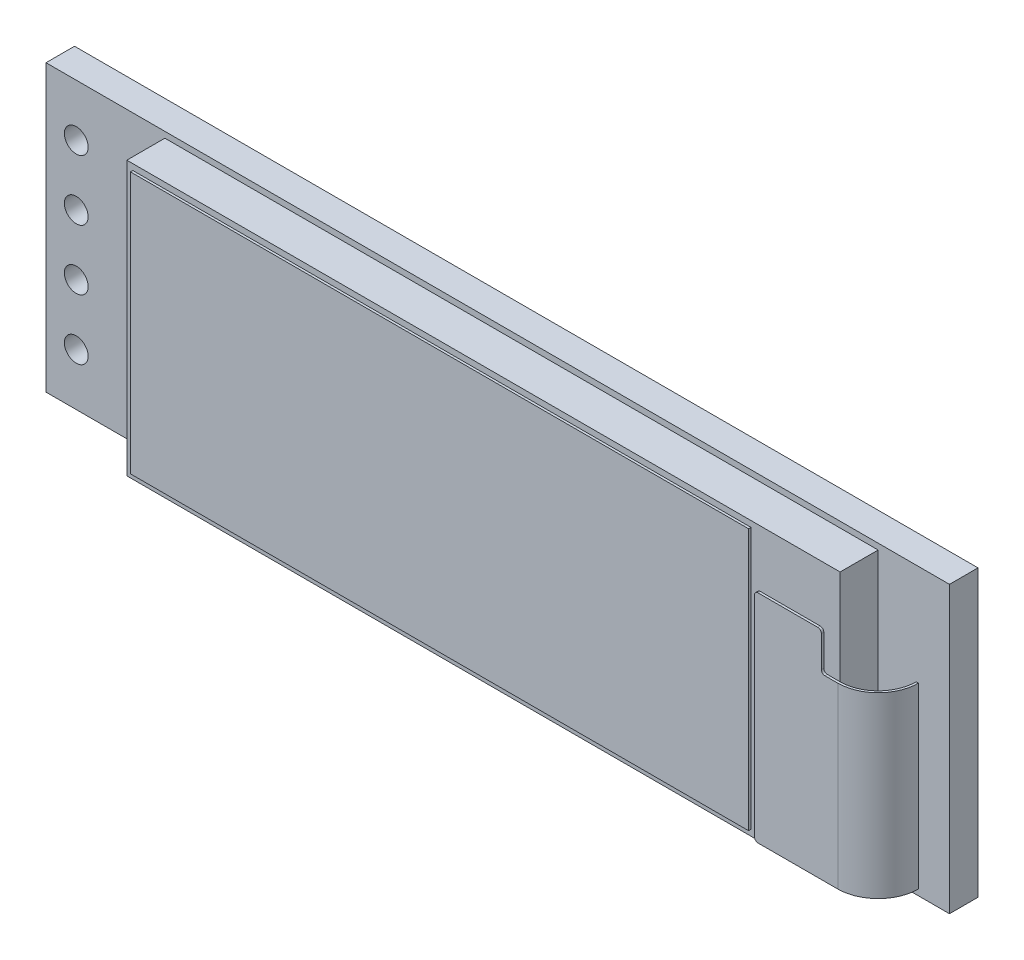
ISO-10303-21;
HEADER;
FILE_DESCRIPTION(('STEP AP214'),'2;1');
FILE_NAME('part.step','',(''),(''),'','','');
FILE_SCHEMA(('AUTOMOTIVE_DESIGN { 1 0 10303 214 1 1 1 1 }'));
ENDSEC;
DATA;
#1=APPLICATION_CONTEXT('core data for automotive mechanical design processes');
#2=APPLICATION_PROTOCOL_DEFINITION('international standard','automotive_design',2000,#1);
#3=PRODUCT_CONTEXT('',#1,'mechanical');
#4=PRODUCT('Part','Part','',(#3));
#5=PRODUCT_RELATED_PRODUCT_CATEGORY('part','',(#4));
#6=PRODUCT_DEFINITION_FORMATION('','',#4);
#7=PRODUCT_DEFINITION_CONTEXT('part definition',#1,'design');
#8=PRODUCT_DEFINITION('design','',#6,#7);
#9=PRODUCT_DEFINITION_SHAPE('','',#8);
#10=(LENGTH_UNIT() NAMED_UNIT(*) SI_UNIT(.MILLI.,.METRE.));
#11=(NAMED_UNIT(*) PLANE_ANGLE_UNIT() SI_UNIT($,.RADIAN.));
#12=(NAMED_UNIT(*) SI_UNIT($,.STERADIAN.) SOLID_ANGLE_UNIT());
#13=UNCERTAINTY_MEASURE_WITH_UNIT(LENGTH_MEASURE(1.E-05),#10,'distance_accuracy_value','');
#14=(GEOMETRIC_REPRESENTATION_CONTEXT(3) GLOBAL_UNCERTAINTY_ASSIGNED_CONTEXT((#13)) GLOBAL_UNIT_ASSIGNED_CONTEXT((#10,
#11,#12)) REPRESENTATION_CONTEXT('',''));
#15=CARTESIAN_POINT('',(0.,0.,0.));
#16=DIRECTION('',(0.,0.,1.));
#17=DIRECTION('',(1.,0.,0.));
#18=AXIS2_PLACEMENT_3D('',#15,#16,#17);
#19=CARTESIAN_POINT('',(16.,1.75,1.2));
#20=DIRECTION('',(0.,-1.,0.));
#21=DIRECTION('',(0.,0.,-1.));
#22=AXIS2_PLACEMENT_3D('',#19,#20,#21);
#23=CYLINDRICAL_SURFACE('',#22,1.69619898871096);
#24=CARTESIAN_POINT('',(16.,-5.75,1.2));
#25=DIRECTION('',(0.,-1.,0.));
#26=DIRECTION('',(0.,0.,1.));
#27=AXIS2_PLACEMENT_3D('',#24,#25,#26);
#28=CIRCLE('',#27,1.69619898871096);
#29=CARTESIAN_POINT('',(17.696198988711,-5.75,1.2));
#30=VERTEX_POINT('',#29);
#31=CARTESIAN_POINT('',(16.,-5.75,2.89809949435548));
#32=VERTEX_POINT('',#31);
#33=EDGE_CURVE('E372',#30,#32,#28,.T.);
#34=ORIENTED_EDGE('',*,*,#33,.F.);
#35=DIRECTION('',(0.,-1.,0.));
#36=VECTOR('',#35,1.);
#37=CARTESIAN_POINT('',(17.696198988711,1.75,1.2));
#38=LINE('',#37,#36);
#39=CARTESIAN_POINT('',(17.696198988711,1.75,1.2));
#40=VERTEX_POINT('',#39);
#41=EDGE_CURVE('E11',#40,#30,#38,.T.);
#42=ORIENTED_EDGE('',*,*,#41,.F.);
#43=CARTESIAN_POINT('',(16.,1.75,1.2));
#44=DIRECTION('',(0.,-1.,0.));
#45=DIRECTION('',(0.,0.,1.));
#46=AXIS2_PLACEMENT_3D('',#43,#44,#45);
#47=CIRCLE('',#46,1.69619898871096);
#48=CARTESIAN_POINT('',(16.,1.75,2.89809949435548));
#49=VERTEX_POINT('',#48);
#50=EDGE_CURVE('E57',#40,#49,#47,.T.);
#51=ORIENTED_EDGE('',*,*,#50,.T.);
#52=CARTESIAN_POINT('',(16.,1.75,2.89619898871096));
#53=DIRECTION('',(0.,-1.,0.));
#54=VECTOR('',#53,1.);
#55=LINE('',#52,#54);
#56=EDGE_CURVE('E66',#49,#32,#55,.T.);
#57=ORIENTED_EDGE('',*,*,#56,.T.);
#58=EDGE_LOOP('',(#34,#42,#51,#57));
#59=FACE_BOUND('',#58,.T.);
#60=ADVANCED_FACE('F39',(#59),#23,.T.);
#61=CARTESIAN_POINT('',(16.,1.75,1.2));
#62=DIRECTION('',(0.,-1.,0.));
#63=DIRECTION('',(0.,0.,-1.));
#64=AXIS2_PLACEMENT_3D('',#61,#62,#63);
#65=CYLINDRICAL_SURFACE('',#64,1.6);
#66=CARTESIAN_POINT('',(16.,-5.75,1.2));
#67=DIRECTION('',(0.,1.,0.));
#68=DIRECTION('',(0.,0.,1.));
#69=AXIS2_PLACEMENT_3D('',#66,#67,#68);
#70=CIRCLE('',#69,1.6);
#71=CARTESIAN_POINT('',(16.,-5.75,2.8));
#72=VERTEX_POINT('',#71);
#73=CARTESIAN_POINT('',(17.6,-5.75,1.2));
#74=VERTEX_POINT('',#73);
#75=EDGE_CURVE('E437',#72,#74,#70,.T.);
#76=ORIENTED_EDGE('',*,*,#75,.F.);
#77=DIRECTION('',(0.,-1.,0.));
#78=VECTOR('',#77,1.);
#79=CARTESIAN_POINT('',(16.,1.75,2.8));
#80=LINE('',#79,#78);
#81=CARTESIAN_POINT('',(16.,1.75,2.8));
#82=VERTEX_POINT('',#81);
#83=EDGE_CURVE('E440',#82,#72,#80,.T.);
#84=ORIENTED_EDGE('',*,*,#83,.F.);
#85=CARTESIAN_POINT('',(16.,1.75,1.2));
#86=DIRECTION('',(0.,1.,0.));
#87=DIRECTION('',(0.,0.,1.));
#88=AXIS2_PLACEMENT_3D('',#85,#86,#87);
#89=CIRCLE('',#88,1.6);
#90=CARTESIAN_POINT('',(17.6,1.75,1.2));
#91=VERTEX_POINT('',#90);
#92=EDGE_CURVE('E462',#82,#91,#89,.T.);
#93=ORIENTED_EDGE('',*,*,#92,.T.);
#94=DIRECTION('',(0.,-1.,0.));
#95=VECTOR('',#94,1.);
#96=CARTESIAN_POINT('',(17.6,1.75,1.2));
#97=LINE('',#96,#95);
#98=EDGE_CURVE('E49',#91,#74,#97,.T.);
#99=ORIENTED_EDGE('',*,*,#98,.T.);
#100=EDGE_LOOP('',(#76,#84,#93,#99));
#101=FACE_BOUND('',#100,.T.);
#102=ADVANCED_FACE('F424',(#101),#65,.F.);
#103=CARTESIAN_POINT('',(16.,1.75,1.2));
#104=DIRECTION('',(0.,1.,0.));
#105=DIRECTION('',(0.,0.,1.));
#106=AXIS2_PLACEMENT_3D('',#103,#104,#105);
#107=PLANE('',#106);
#108=ORIENTED_EDGE('',*,*,#50,.F.);
#109=DIRECTION('',(1.,0.,0.));
#110=VECTOR('',#109,1.);
#111=CARTESIAN_POINT('',(17.6,1.75,1.2));
#112=LINE('',#111,#110);
#113=EDGE_CURVE('E448',#91,#40,#112,.T.);
#114=ORIENTED_EDGE('',*,*,#113,.F.);
#115=ORIENTED_EDGE('',*,*,#92,.F.);
#116=DIRECTION('',(-1.,0.,0.));
#117=VECTOR('',#116,1.);
#118=CARTESIAN_POINT('',(16.,1.75,2.8));
#119=LINE('',#118,#117);
#120=CARTESIAN_POINT('',(15.4636021064431,1.75,2.8));
#121=VERTEX_POINT('',#120);
#122=EDGE_CURVE('E296',#82,#121,#119,.T.);
#123=ORIENTED_EDGE('',*,*,#122,.T.);
#124=DIRECTION('',(0.,0.,-1.));
#125=VECTOR('',#124,1.);
#126=CARTESIAN_POINT('',(15.4636021064431,1.75,2.9));
#127=LINE('',#126,#125);
#128=CARTESIAN_POINT('',(15.4636021064431,1.75,2.9));
#129=VERTEX_POINT('',#128);
#130=EDGE_CURVE('E369',#129,#121,#127,.T.);
#131=ORIENTED_EDGE('',*,*,#130,.F.);
#132=DIRECTION('',(-1.,0.,0.));
#133=VECTOR('',#132,1.);
#134=CARTESIAN_POINT('',(16.,1.75,2.9));
#135=LINE('',#134,#133);
#136=EDGE_CURVE('E313',#49,#129,#135,.T.);
#137=ORIENTED_EDGE('',*,*,#136,.F.);
#138=EDGE_LOOP('',(#108,#114,#115,#123,#131,#137));
#139=FACE_BOUND('',#138,.T.);
#140=ADVANCED_FACE('F421',(#139),#107,.T.);
#141=CARTESIAN_POINT('',(16.,-5.75,1.2));
#142=DIRECTION('',(0.,1.,0.));
#143=DIRECTION('',(0.,0.,1.));
#144=AXIS2_PLACEMENT_3D('',#141,#142,#143);
#145=PLANE('',#144);
#146=ORIENTED_EDGE('',*,*,#33,.T.);
#147=DIRECTION('',(1.,0.,0.));
#148=VECTOR('',#147,1.);
#149=CARTESIAN_POINT('',(12.6495314069062,-5.75,2.9));
#150=LINE('',#149,#148);
#151=CARTESIAN_POINT('',(12.6495314069062,-5.75,2.9));
#152=VERTEX_POINT('',#151);
#153=EDGE_CURVE('E324',#152,#32,#150,.T.);
#154=ORIENTED_EDGE('',*,*,#153,.F.);
#155=DIRECTION('',(0.,0.,-1.));
#156=VECTOR('',#155,1.);
#157=CARTESIAN_POINT('',(12.6495314069062,-5.75,2.9));
#158=LINE('',#157,#156);
#159=CARTESIAN_POINT('',(12.6495314069062,-5.75,2.8));
#160=VERTEX_POINT('',#159);
#161=EDGE_CURVE('E348',#152,#160,#158,.T.);
#162=ORIENTED_EDGE('',*,*,#161,.T.);
#163=DIRECTION('',(1.,0.,0.));
#164=VECTOR('',#163,1.);
#165=CARTESIAN_POINT('',(-14.,-5.75,2.8));
#166=LINE('',#165,#164);
#167=CARTESIAN_POINT('',(-14.,-5.75,2.8));
#168=VERTEX_POINT('',#167);
#169=EDGE_CURVE('E245',#168,#160,#166,.T.);
#170=ORIENTED_EDGE('',*,*,#169,.F.);
#171=DIRECTION('',(0.,0.,-1.));
#172=VECTOR('',#171,1.);
#173=CARTESIAN_POINT('',(-14.,-5.75,2.8));
#174=LINE('',#173,#172);
#175=CARTESIAN_POINT('',(-14.,-5.75,1.2));
#176=VERTEX_POINT('',#175);
#177=EDGE_CURVE('E257',#168,#176,#174,.T.);
#178=ORIENTED_EDGE('',*,*,#177,.T.);
#179=DIRECTION('',(1.,0.,0.));
#180=VECTOR('',#179,1.);
#181=CARTESIAN_POINT('',(-14.,-5.75,1.2));
#182=LINE('',#181,#180);
#183=CARTESIAN_POINT('',(16.,-5.75,1.2));
#184=VERTEX_POINT('',#183);
#185=EDGE_CURVE('E241',#176,#184,#182,.T.);
#186=ORIENTED_EDGE('',*,*,#185,.T.);
#187=DIRECTION('',(0.,0.,-1.));
#188=VECTOR('',#187,1.);
#189=CARTESIAN_POINT('',(16.,-5.75,2.8));
#190=LINE('',#189,#188);
#191=EDGE_CURVE('E246',#72,#184,#190,.T.);
#192=ORIENTED_EDGE('',*,*,#191,.F.);
#193=ORIENTED_EDGE('',*,*,#75,.T.);
#194=DIRECTION('',(1.,0.,0.));
#195=VECTOR('',#194,1.);
#196=CARTESIAN_POINT('',(17.6,-5.75,1.2));
#197=LINE('',#196,#195);
#198=EDGE_CURVE('E444',#74,#30,#197,.T.);
#199=ORIENTED_EDGE('',*,*,#198,.T.);
#200=EDGE_LOOP('',(#146,#154,#162,#170,#178,#186,#192,#193,#199));
#201=FACE_BOUND('',#200,.T.);
#202=ADVANCED_FACE('F419',(#201),#145,.F.);
#203=CARTESIAN_POINT('',(15.4636021064431,1.9,2.9));
#204=DIRECTION('',(0.,0.,-1.));
#205=DIRECTION('',(-1.,0.,0.));
#206=AXIS2_PLACEMENT_3D('',#203,#204,#205);
#207=CYLINDRICAL_SURFACE('',#206,0.15);
#208=CARTESIAN_POINT('',(15.4636021064431,1.9,2.8));
#209=DIRECTION('',(0.,0.,-1.));
#210=DIRECTION('',(-1.,0.,0.));
#211=AXIS2_PLACEMENT_3D('',#208,#209,#210);
#212=CIRCLE('',#211,0.15);
#213=CARTESIAN_POINT('',(15.3136021064431,1.9,2.8));
#214=VERTEX_POINT('',#213);
#215=EDGE_CURVE('E327',#121,#214,#212,.T.);
#216=ORIENTED_EDGE('',*,*,#215,.T.);
#217=DIRECTION('',(0.,0.,-1.));
#218=VECTOR('',#217,1.);
#219=CARTESIAN_POINT('',(15.3136021064431,1.9,2.9));
#220=LINE('',#219,#218);
#221=CARTESIAN_POINT('',(15.3136021064431,1.9,2.9));
#222=VERTEX_POINT('',#221);
#223=EDGE_CURVE('E366',#222,#214,#220,.T.);
#224=ORIENTED_EDGE('',*,*,#223,.F.);
#225=CARTESIAN_POINT('',(15.4636021064431,1.9,2.9));
#226=DIRECTION('',(0.,0.,-1.));
#227=DIRECTION('',(-1.,0.,0.));
#228=AXIS2_PLACEMENT_3D('',#225,#226,#227);
#229=CIRCLE('',#228,0.15);
#230=EDGE_CURVE('E310',#129,#222,#229,.T.);
#231=ORIENTED_EDGE('',*,*,#230,.F.);
#232=ORIENTED_EDGE('',*,*,#130,.T.);
#233=EDGE_LOOP('',(#216,#224,#231,#232));
#234=FACE_BOUND('',#233,.T.);
#235=ADVANCED_FACE('F415',(#234),#207,.F.);
#236=CARTESIAN_POINT('',(15.3136021064431,1.9,2.9));
#237=DIRECTION('',(-1.,0.,0.));
#238=DIRECTION('',(0.,0.,1.));
#239=AXIS2_PLACEMENT_3D('',#236,#237,#238);
#240=PLANE('',#239);
#241=DIRECTION('',(0.,1.,0.));
#242=VECTOR('',#241,1.);
#243=CARTESIAN_POINT('',(15.3136021064431,1.9,2.8));
#244=LINE('',#243,#242);
#245=CARTESIAN_POINT('',(15.3136021064431,3.21377728050559,2.8));
#246=VERTEX_POINT('',#245);
#247=EDGE_CURVE('E330',#214,#246,#244,.T.);
#248=ORIENTED_EDGE('',*,*,#247,.T.);
#249=DIRECTION('',(0.,0.,-1.));
#250=VECTOR('',#249,1.);
#251=CARTESIAN_POINT('',(15.3136021064431,3.21377728050559,2.9));
#252=LINE('',#251,#250);
#253=CARTESIAN_POINT('',(15.3136021064431,3.21377728050559,2.9));
#254=VERTEX_POINT('',#253);
#255=EDGE_CURVE('E363',#254,#246,#252,.T.);
#256=ORIENTED_EDGE('',*,*,#255,.F.);
#257=DIRECTION('',(0.,1.,0.));
#258=VECTOR('',#257,1.);
#259=CARTESIAN_POINT('',(15.3136021064431,1.9,2.9));
#260=LINE('',#259,#258);
#261=EDGE_CURVE('E312',#222,#254,#260,.T.);
#262=ORIENTED_EDGE('',*,*,#261,.F.);
#263=ORIENTED_EDGE('',*,*,#223,.T.);
#264=EDGE_LOOP('',(#248,#256,#262,#263));
#265=FACE_BOUND('',#264,.T.);
#266=ADVANCED_FACE('F411',(#265),#240,.F.);
#267=CARTESIAN_POINT('',(15.1636021064431,3.21377728050559,2.9));
#268=DIRECTION('',(0.,0.,-1.));
#269=DIRECTION('',(-1.,0.,0.));
#270=AXIS2_PLACEMENT_3D('',#267,#268,#269);
#271=CYLINDRICAL_SURFACE('',#270,0.15);
#272=CARTESIAN_POINT('',(15.1636021064431,3.21377728050559,2.8));
#273=DIRECTION('',(0.,0.,1.));
#274=DIRECTION('',(-1.,0.,0.));
#275=AXIS2_PLACEMENT_3D('',#272,#273,#274);
#276=CIRCLE('',#275,0.15);
#277=CARTESIAN_POINT('',(15.1636021064431,3.36377728050559,2.8));
#278=VERTEX_POINT('',#277);
#279=EDGE_CURVE('E333',#246,#278,#276,.T.);
#280=ORIENTED_EDGE('',*,*,#279,.T.);
#281=DIRECTION('',(0.,0.,-1.));
#282=VECTOR('',#281,1.);
#283=CARTESIAN_POINT('',(15.1636021064431,3.36377728050559,2.9));
#284=LINE('',#283,#282);
#285=CARTESIAN_POINT('',(15.1636021064431,3.36377728050559,2.9));
#286=VERTEX_POINT('',#285);
#287=EDGE_CURVE('E360',#286,#278,#284,.T.);
#288=ORIENTED_EDGE('',*,*,#287,.F.);
#289=CARTESIAN_POINT('',(15.1636021064431,3.21377728050559,2.9));
#290=DIRECTION('',(0.,0.,1.));
#291=DIRECTION('',(-1.,0.,0.));
#292=AXIS2_PLACEMENT_3D('',#289,#290,#291);
#293=CIRCLE('',#292,0.15);
#294=EDGE_CURVE('E315',#254,#286,#293,.T.);
#295=ORIENTED_EDGE('',*,*,#294,.F.);
#296=ORIENTED_EDGE('',*,*,#255,.T.);
#297=EDGE_LOOP('',(#280,#288,#295,#296));
#298=FACE_BOUND('',#297,.T.);
#299=ADVANCED_FACE('F407',(#298),#271,.T.);
#300=CARTESIAN_POINT('',(15.1636021064431,3.36377728050559,2.9));
#301=DIRECTION('',(0.,-1.,0.));
#302=DIRECTION('',(0.,0.,-1.));
#303=AXIS2_PLACEMENT_3D('',#300,#301,#302);
#304=PLANE('',#303);
#305=DIRECTION('',(-1.,0.,0.));
#306=VECTOR('',#305,1.);
#307=CARTESIAN_POINT('',(15.1636021064431,3.36377728050559,2.8));
#308=LINE('',#307,#306);
#309=CARTESIAN_POINT('',(12.6495314069062,3.36377728050559,2.8));
#310=VERTEX_POINT('',#309);
#311=EDGE_CURVE('E336',#278,#310,#308,.T.);
#312=ORIENTED_EDGE('',*,*,#311,.T.);
#313=DIRECTION('',(0.,0.,-1.));
#314=VECTOR('',#313,1.);
#315=CARTESIAN_POINT('',(12.6495314069062,3.36377728050559,2.9));
#316=LINE('',#315,#314);
#317=CARTESIAN_POINT('',(12.6495314069062,3.36377728050559,2.9));
#318=VERTEX_POINT('',#317);
#319=EDGE_CURVE('E357',#318,#310,#316,.T.);
#320=ORIENTED_EDGE('',*,*,#319,.F.);
#321=DIRECTION('',(-1.,0.,0.));
#322=VECTOR('',#321,1.);
#323=CARTESIAN_POINT('',(15.1636021064431,3.36377728050559,2.9));
#324=LINE('',#323,#322);
#325=EDGE_CURVE('E317',#286,#318,#324,.T.);
#326=ORIENTED_EDGE('',*,*,#325,.F.);
#327=ORIENTED_EDGE('',*,*,#287,.T.);
#328=EDGE_LOOP('',(#312,#320,#326,#327));
#329=FACE_BOUND('',#328,.T.);
#330=ADVANCED_FACE('F403',(#329),#304,.F.);
#331=CARTESIAN_POINT('',(12.6495314069062,3.21377728050559,2.9));
#332=DIRECTION('',(0.,0.,-1.));
#333=DIRECTION('',(-1.,0.,0.));
#334=AXIS2_PLACEMENT_3D('',#331,#332,#333);
#335=CYLINDRICAL_SURFACE('',#334,0.15);
#336=CARTESIAN_POINT('',(12.6495314069062,3.21377728050559,2.8));
#337=DIRECTION('',(0.,0.,1.));
#338=DIRECTION('',(-1.,0.,0.));
#339=AXIS2_PLACEMENT_3D('',#336,#337,#338);
#340=CIRCLE('',#339,0.15);
#341=CARTESIAN_POINT('',(12.4995314069062,3.21377728050559,2.8));
#342=VERTEX_POINT('',#341);
#343=EDGE_CURVE('E339',#310,#342,#340,.T.);
#344=ORIENTED_EDGE('',*,*,#343,.T.);
#345=DIRECTION('',(0.,0.,-1.));
#346=VECTOR('',#345,1.);
#347=CARTESIAN_POINT('',(12.4995314069062,3.21377728050559,2.9));
#348=LINE('',#347,#346);
#349=CARTESIAN_POINT('',(12.4995314069062,3.21377728050559,2.9));
#350=VERTEX_POINT('',#349);
#351=EDGE_CURVE('E354',#350,#342,#348,.T.);
#352=ORIENTED_EDGE('',*,*,#351,.F.);
#353=CARTESIAN_POINT('',(12.6495314069062,3.21377728050559,2.9));
#354=DIRECTION('',(0.,0.,1.));
#355=DIRECTION('',(-1.,0.,0.));
#356=AXIS2_PLACEMENT_3D('',#353,#354,#355);
#357=CIRCLE('',#356,0.15);
#358=EDGE_CURVE('E319',#318,#350,#357,.T.);
#359=ORIENTED_EDGE('',*,*,#358,.F.);
#360=ORIENTED_EDGE('',*,*,#319,.T.);
#361=EDGE_LOOP('',(#344,#352,#359,#360));
#362=FACE_BOUND('',#361,.T.);
#363=ADVANCED_FACE('F399',(#362),#335,.T.);
#364=CARTESIAN_POINT('',(12.4995314069062,3.21377728050559,2.9));
#365=DIRECTION('',(1.,0.,0.));
#366=DIRECTION('',(0.,0.,-1.));
#367=AXIS2_PLACEMENT_3D('',#364,#365,#366);
#368=PLANE('',#367);
#369=DIRECTION('',(0.,-1.,0.));
#370=VECTOR('',#369,1.);
#371=CARTESIAN_POINT('',(12.4995314069062,3.21377728050559,2.8));
#372=LINE('',#371,#370);
#373=CARTESIAN_POINT('',(12.4995314069062,-5.6,2.8));
#374=VERTEX_POINT('',#373);
#375=EDGE_CURVE('E342',#342,#374,#372,.T.);
#376=ORIENTED_EDGE('',*,*,#375,.T.);
#377=DIRECTION('',(0.,0.,-1.));
#378=VECTOR('',#377,1.);
#379=CARTESIAN_POINT('',(12.4995314069062,-5.6,2.9));
#380=LINE('',#379,#378);
#381=CARTESIAN_POINT('',(12.4995314069062,-5.6,2.9));
#382=VERTEX_POINT('',#381);
#383=EDGE_CURVE('E351',#382,#374,#380,.T.);
#384=ORIENTED_EDGE('',*,*,#383,.F.);
#385=DIRECTION('',(0.,-1.,0.));
#386=VECTOR('',#385,1.);
#387=CARTESIAN_POINT('',(12.4995314069062,3.21377728050559,2.9));
#388=LINE('',#387,#386);
#389=EDGE_CURVE('E321',#350,#382,#388,.T.);
#390=ORIENTED_EDGE('',*,*,#389,.F.);
#391=ORIENTED_EDGE('',*,*,#351,.T.);
#392=EDGE_LOOP('',(#376,#384,#390,#391));
#393=FACE_BOUND('',#392,.T.);
#394=ADVANCED_FACE('F395',(#393),#368,.F.);
#395=CARTESIAN_POINT('',(12.6495314069062,-5.6,2.9));
#396=DIRECTION('',(0.,0.,-1.));
#397=DIRECTION('',(-1.,0.,0.));
#398=AXIS2_PLACEMENT_3D('',#395,#396,#397);
#399=CYLINDRICAL_SURFACE('',#398,0.15);
#400=CARTESIAN_POINT('',(12.6495314069062,-5.6,2.8));
#401=DIRECTION('',(0.,0.,1.));
#402=DIRECTION('',(-1.,0.,0.));
#403=AXIS2_PLACEMENT_3D('',#400,#401,#402);
#404=CIRCLE('',#403,0.15);
#405=EDGE_CURVE('E345',#374,#160,#404,.T.);
#406=ORIENTED_EDGE('',*,*,#405,.T.);
#407=ORIENTED_EDGE('',*,*,#161,.F.);
#408=CARTESIAN_POINT('',(12.6495314069062,-5.6,2.9));
#409=DIRECTION('',(0.,0.,1.));
#410=DIRECTION('',(-1.,0.,0.));
#411=AXIS2_PLACEMENT_3D('',#408,#409,#410);
#412=CIRCLE('',#411,0.15);
#413=EDGE_CURVE('E75',#382,#152,#412,.T.);
#414=ORIENTED_EDGE('',*,*,#413,.F.);
#415=ORIENTED_EDGE('',*,*,#383,.T.);
#416=EDGE_LOOP('',(#406,#407,#414,#415));
#417=FACE_BOUND('',#416,.T.);
#418=ADVANCED_FACE('F390',(#417),#399,.T.);
#419=CARTESIAN_POINT('',(15.4636021064431,1.9,2.9));
#420=DIRECTION('',(0.,0.,-1.));
#421=DIRECTION('',(-1.,0.,0.));
#422=AXIS2_PLACEMENT_3D('',#419,#420,#421);
#423=PLANE('',#422);
#424=ORIENTED_EDGE('',*,*,#56,.F.);
#425=ORIENTED_EDGE('',*,*,#136,.T.);
#426=ORIENTED_EDGE('',*,*,#230,.T.);
#427=ORIENTED_EDGE('',*,*,#261,.T.);
#428=ORIENTED_EDGE('',*,*,#294,.T.);
#429=ORIENTED_EDGE('',*,*,#325,.T.);
#430=ORIENTED_EDGE('',*,*,#358,.T.);
#431=ORIENTED_EDGE('',*,*,#389,.T.);
#432=ORIENTED_EDGE('',*,*,#413,.T.);
#433=ORIENTED_EDGE('',*,*,#153,.T.);
#434=EDGE_LOOP('',(#424,#425,#426,#427,#428,#429,#430,#431,#432,#433));
#435=FACE_BOUND('',#434,.T.);
#436=ADVANCED_FACE('F379',(#435),#423,.F.);
#437=CARTESIAN_POINT('',(0.,0.,2.8));
#438=DIRECTION('',(0.,0.,-1.));
#439=DIRECTION('',(-1.,0.,0.));
#440=AXIS2_PLACEMENT_3D('',#437,#438,#439);
#441=PLANE('',#440);
#442=DIRECTION('',(0.,1.,0.));
#443=VECTOR('',#442,1.);
#444=CARTESIAN_POINT('',(12.25,5.5,2.8));
#445=LINE('',#444,#443);
#446=CARTESIAN_POINT('',(12.25,-5.5,2.8));
#447=VERTEX_POINT('',#446);
#448=CARTESIAN_POINT('',(12.25,5.5,2.8));
#449=VERTEX_POINT('',#448);
#450=EDGE_CURVE('E228',#447,#449,#445,.T.);
#451=ORIENTED_EDGE('',*,*,#450,.F.);
#452=DIRECTION('',(1.,0.,0.));
#453=VECTOR('',#452,1.);
#454=CARTESIAN_POINT('',(-13.75,-5.5,2.8));
#455=LINE('',#454,#453);
#456=CARTESIAN_POINT('',(-13.75,-5.5,2.8));
#457=VERTEX_POINT('',#456);
#458=EDGE_CURVE('E225',#457,#447,#455,.T.);
#459=ORIENTED_EDGE('',*,*,#458,.F.);
#460=DIRECTION('',(0.,-1.,0.));
#461=VECTOR('',#460,1.);
#462=CARTESIAN_POINT('',(-13.75,5.5,2.8));
#463=LINE('',#462,#461);
#464=CARTESIAN_POINT('',(-13.75,5.5,2.8));
#465=VERTEX_POINT('',#464);
#466=EDGE_CURVE('E820',#465,#457,#463,.T.);
#467=ORIENTED_EDGE('',*,*,#466,.F.);
#468=DIRECTION('',(-1.,0.,0.));
#469=VECTOR('',#468,1.);
#470=CARTESIAN_POINT('',(-13.75,5.5,2.8));
#471=LINE('',#470,#469);
#472=EDGE_CURVE('E818',#449,#465,#471,.T.);
#473=ORIENTED_EDGE('',*,*,#472,.F.);
#474=EDGE_LOOP('',(#451,#459,#467,#473));
#475=FACE_BOUND('',#474,.T.);
#476=ORIENTED_EDGE('',*,*,#122,.F.);
#477=DIRECTION('',(0.,1.,0.));
#478=VECTOR('',#477,1.);
#479=CARTESIAN_POINT('',(16.,-5.75,2.8));
#480=LINE('',#479,#478);
#481=CARTESIAN_POINT('',(16.,5.75,2.8));
#482=VERTEX_POINT('',#481);
#483=EDGE_CURVE('E238',#82,#482,#480,.T.);
#484=ORIENTED_EDGE('',*,*,#483,.T.);
#485=DIRECTION('',(-1.,0.,0.));
#486=VECTOR('',#485,1.);
#487=CARTESIAN_POINT('',(-14.,5.75,2.8));
#488=LINE('',#487,#486);
#489=CARTESIAN_POINT('',(-14.,5.75,2.8));
#490=VERTEX_POINT('',#489);
#491=EDGE_CURVE('E240',#482,#490,#488,.T.);
#492=ORIENTED_EDGE('',*,*,#491,.T.);
#493=DIRECTION('',(0.,-1.,0.));
#494=VECTOR('',#493,1.);
#495=CARTESIAN_POINT('',(-14.,-5.75,2.8));
#496=LINE('',#495,#494);
#497=EDGE_CURVE('E243',#490,#168,#496,.T.);
#498=ORIENTED_EDGE('',*,*,#497,.T.);
#499=ORIENTED_EDGE('',*,*,#169,.T.);
#500=ORIENTED_EDGE('',*,*,#405,.F.);
#501=ORIENTED_EDGE('',*,*,#375,.F.);
#502=ORIENTED_EDGE('',*,*,#343,.F.);
#503=ORIENTED_EDGE('',*,*,#311,.F.);
#504=ORIENTED_EDGE('',*,*,#279,.F.);
#505=ORIENTED_EDGE('',*,*,#247,.F.);
#506=ORIENTED_EDGE('',*,*,#215,.F.);
#507=EDGE_LOOP('',(#476,#484,#492,#498,#499,#500,#501,#502,#503,#504,#505,#506));
#508=FACE_BOUND('',#507,.T.);
#509=ADVANCED_FACE('F389',(#475,#508),#441,.F.);
#510=CARTESIAN_POINT('',(-19.,-6.,1.2));
#511=DIRECTION('',(1.,0.,0.));
#512=DIRECTION('',(0.,0.,-1.));
#513=AXIS2_PLACEMENT_3D('',#510,#511,#512);
#514=PLANE('',#513);
#515=DIRECTION('',(0.,-1.,0.));
#516=VECTOR('',#515,1.);
#517=CARTESIAN_POINT('',(-19.,-6.,0.));
#518=LINE('',#517,#516);
#519=CARTESIAN_POINT('',(-19.,6.,0.));
#520=VERTEX_POINT('',#519);
#521=CARTESIAN_POINT('',(-19.,-6.,0.));
#522=VERTEX_POINT('',#521);
#523=EDGE_CURVE('E266',#520,#522,#518,.T.);
#524=ORIENTED_EDGE('',*,*,#523,.T.);
#525=DIRECTION('',(0.,0.,-1.));
#526=VECTOR('',#525,1.);
#527=CARTESIAN_POINT('',(-19.,-6.,1.2));
#528=LINE('',#527,#526);
#529=CARTESIAN_POINT('',(-19.,-6.,1.2));
#530=VERTEX_POINT('',#529);
#531=EDGE_CURVE('E293',#530,#522,#528,.T.);
#532=ORIENTED_EDGE('',*,*,#531,.F.);
#533=DIRECTION('',(0.,-1.,0.));
#534=VECTOR('',#533,1.);
#535=CARTESIAN_POINT('',(-19.,-6.,1.2));
#536=LINE('',#535,#534);
#537=CARTESIAN_POINT('',(-19.,6.,1.2));
#538=VERTEX_POINT('',#537);
#539=EDGE_CURVE('E267',#538,#530,#536,.T.);
#540=ORIENTED_EDGE('',*,*,#539,.F.);
#541=DIRECTION('',(0.,0.,-1.));
#542=VECTOR('',#541,1.);
#543=CARTESIAN_POINT('',(-19.,6.,1.2));
#544=LINE('',#543,#542);
#545=EDGE_CURVE('E277',#538,#520,#544,.T.);
#546=ORIENTED_EDGE('',*,*,#545,.T.);
#547=EDGE_LOOP('',(#524,#532,#540,#546));
#548=FACE_BOUND('',#547,.T.);
#549=ADVANCED_FACE('F391',(#548),#514,.F.);
#550=CARTESIAN_POINT('',(19.,-6.,1.2));
#551=DIRECTION('',(0.,1.,0.));
#552=DIRECTION('',(-1.,0.,0.));
#553=AXIS2_PLACEMENT_3D('',#550,#551,#552);
#554=PLANE('',#553);
#555=DIRECTION('',(1.,0.,0.));
#556=VECTOR('',#555,1.);
#557=CARTESIAN_POINT('',(19.,-6.,0.));
#558=LINE('',#557,#556);
#559=CARTESIAN_POINT('',(19.,-6.,0.));
#560=VERTEX_POINT('',#559);
#561=EDGE_CURVE('E280',#522,#560,#558,.T.);
#562=ORIENTED_EDGE('',*,*,#561,.T.);
#563=DIRECTION('',(0.,0.,-1.));
#564=VECTOR('',#563,1.);
#565=CARTESIAN_POINT('',(19.,-6.,1.2));
#566=LINE('',#565,#564);
#567=CARTESIAN_POINT('',(19.,-6.,1.2));
#568=VERTEX_POINT('',#567);
#569=EDGE_CURVE('E290',#568,#560,#566,.T.);
#570=ORIENTED_EDGE('',*,*,#569,.F.);
#571=DIRECTION('',(1.,0.,0.));
#572=VECTOR('',#571,1.);
#573=CARTESIAN_POINT('',(19.,-6.,1.2));
#574=LINE('',#573,#572);
#575=EDGE_CURVE('E270',#530,#568,#574,.T.);
#576=ORIENTED_EDGE('',*,*,#575,.F.);
#577=ORIENTED_EDGE('',*,*,#531,.T.);
#578=EDGE_LOOP('',(#562,#570,#576,#577));
#579=FACE_BOUND('',#578,.T.);
#580=ADVANCED_FACE('F515',(#579),#554,.F.);
#581=CARTESIAN_POINT('',(19.,-6.,1.2));
#582=DIRECTION('',(-1.,0.,0.));
#583=DIRECTION('',(0.,0.,1.));
#584=AXIS2_PLACEMENT_3D('',#581,#582,#583);
#585=PLANE('',#584);
#586=DIRECTION('',(0.,1.,0.));
#587=VECTOR('',#586,1.);
#588=CARTESIAN_POINT('',(19.,-6.,0.));
#589=LINE('',#588,#587);
#590=CARTESIAN_POINT('',(19.,6.,0.));
#591=VERTEX_POINT('',#590);
#592=EDGE_CURVE('E282',#560,#591,#589,.T.);
#593=ORIENTED_EDGE('',*,*,#592,.T.);
#594=DIRECTION('',(0.,0.,-1.));
#595=VECTOR('',#594,1.);
#596=CARTESIAN_POINT('',(19.,6.,1.2));
#597=LINE('',#596,#595);
#598=CARTESIAN_POINT('',(19.,6.,1.2));
#599=VERTEX_POINT('',#598);
#600=EDGE_CURVE('E287',#599,#591,#597,.T.);
#601=ORIENTED_EDGE('',*,*,#600,.F.);
#602=DIRECTION('',(0.,1.,0.));
#603=VECTOR('',#602,1.);
#604=CARTESIAN_POINT('',(19.,-6.,1.2));
#605=LINE('',#604,#603);
#606=EDGE_CURVE('E273',#568,#599,#605,.T.);
#607=ORIENTED_EDGE('',*,*,#606,.F.);
#608=ORIENTED_EDGE('',*,*,#569,.T.);
#609=EDGE_LOOP('',(#593,#601,#607,#608));
#610=FACE_BOUND('',#609,.T.);
#611=ADVANCED_FACE('F520',(#610),#585,.F.);
#612=CARTESIAN_POINT('',(19.,6.,1.2));
#613=DIRECTION('',(0.,-1.,0.));
#614=DIRECTION('',(1.,0.,0.));
#615=AXIS2_PLACEMENT_3D('',#612,#613,#614);
#616=PLANE('',#615);
#617=DIRECTION('',(-1.,0.,0.));
#618=VECTOR('',#617,1.);
#619=CARTESIAN_POINT('',(19.,6.,0.));
#620=LINE('',#619,#618);
#621=EDGE_CURVE('E271',#591,#520,#620,.T.);
#622=ORIENTED_EDGE('',*,*,#621,.T.);
#623=ORIENTED_EDGE('',*,*,#545,.F.);
#624=DIRECTION('',(-1.,0.,0.));
#625=VECTOR('',#624,1.);
#626=CARTESIAN_POINT('',(19.,6.,1.2));
#627=LINE('',#626,#625);
#628=EDGE_CURVE('E275',#599,#538,#627,.T.);
#629=ORIENTED_EDGE('',*,*,#628,.F.);
#630=ORIENTED_EDGE('',*,*,#600,.T.);
#631=EDGE_LOOP('',(#622,#623,#629,#630));
#632=FACE_BOUND('',#631,.T.);
#633=ADVANCED_FACE('F489',(#632),#616,.F.);
#634=CARTESIAN_POINT('',(0.,0.,1.2));
#635=DIRECTION('',(0.,0.,1.));
#636=DIRECTION('',(1.,0.,0.));
#637=AXIS2_PLACEMENT_3D('',#634,#635,#636);
#638=PLANE('',#637);
#639=ORIENTED_EDGE('',*,*,#98,.F.);
#640=ORIENTED_EDGE('',*,*,#113,.T.);
#641=ORIENTED_EDGE('',*,*,#41,.T.);
#642=ORIENTED_EDGE('',*,*,#198,.F.);
#643=EDGE_LOOP('',(#639,#640,#641,#642));
#644=FACE_BOUND('',#643,.T.);
#645=CARTESIAN_POINT('',(-17.7281370199482,-3.81,1.2));
#646=DIRECTION('',(0.,0.,1.));
#647=DIRECTION('',(1.,0.,0.));
#648=AXIS2_PLACEMENT_3D('',#645,#646,#647);
#649=CIRCLE('',#648,0.499999999999999);
#650=CARTESIAN_POINT('',(-17.2281370199482,-3.81,1.2));
#651=VERTEX_POINT('',#650);
#652=EDGE_CURVE('E494',#651,#651,#649,.T.);
#653=ORIENTED_EDGE('',*,*,#652,.F.);
#654=EDGE_LOOP('',(#653));
#655=FACE_BOUND('',#654,.T.);
#656=CARTESIAN_POINT('',(-17.7281370199482,-1.27,1.2));
#657=DIRECTION('',(0.,0.,1.));
#658=DIRECTION('',(1.,0.,0.));
#659=AXIS2_PLACEMENT_3D('',#656,#657,#658);
#660=CIRCLE('',#659,0.499999999999999);
#661=CARTESIAN_POINT('',(-17.2281370199482,-1.27,1.2));
#662=VERTEX_POINT('',#661);
#663=EDGE_CURVE('E498',#662,#662,#660,.T.);
#664=ORIENTED_EDGE('',*,*,#663,.F.);
#665=EDGE_LOOP('',(#664));
#666=FACE_BOUND('',#665,.T.);
#667=CARTESIAN_POINT('',(-17.7281370199482,3.81,1.2));
#668=DIRECTION('',(0.,0.,1.));
#669=DIRECTION('',(1.,0.,0.));
#670=AXIS2_PLACEMENT_3D('',#667,#668,#669);
#671=CIRCLE('',#670,0.499999999999999);
#672=CARTESIAN_POINT('',(-17.2281370199482,3.81,1.2));
#673=VERTEX_POINT('',#672);
#674=EDGE_CURVE('E502',#673,#673,#671,.T.);
#675=ORIENTED_EDGE('',*,*,#674,.F.);
#676=EDGE_LOOP('',(#675));
#677=FACE_BOUND('',#676,.T.);
#678=CARTESIAN_POINT('',(-17.7281370199482,1.27,1.2));
#679=DIRECTION('',(0.,0.,1.));
#680=DIRECTION('',(1.,0.,0.));
#681=AXIS2_PLACEMENT_3D('',#678,#679,#680);
#682=CIRCLE('',#681,0.499999999999999);
#683=CARTESIAN_POINT('',(-17.2281370199482,1.27,1.2));
#684=VERTEX_POINT('',#683);
#685=EDGE_CURVE('E301',#684,#684,#682,.T.);
#686=ORIENTED_EDGE('',*,*,#685,.F.);
#687=EDGE_LOOP('',(#686));
#688=FACE_BOUND('',#687,.T.);
#689=DIRECTION('',(0.,1.,0.));
#690=VECTOR('',#689,1.);
#691=CARTESIAN_POINT('',(16.,-5.75,1.2));
#692=LINE('',#691,#690);
#693=CARTESIAN_POINT('',(16.,5.75,1.2));
#694=VERTEX_POINT('',#693);
#695=EDGE_CURVE('E229',#184,#694,#692,.T.);
#696=ORIENTED_EDGE('',*,*,#695,.F.);
#697=ORIENTED_EDGE('',*,*,#185,.F.);
#698=DIRECTION('',(0.,-1.,0.));
#699=VECTOR('',#698,1.);
#700=CARTESIAN_POINT('',(-14.,-5.75,1.2));
#701=LINE('',#700,#699);
#702=CARTESIAN_POINT('',(-14.,5.75,1.2));
#703=VERTEX_POINT('',#702);
#704=EDGE_CURVE('E250',#703,#176,#701,.T.);
#705=ORIENTED_EDGE('',*,*,#704,.F.);
#706=DIRECTION('',(-1.,0.,0.));
#707=VECTOR('',#706,1.);
#708=CARTESIAN_POINT('',(-14.,5.75,1.2));
#709=LINE('',#708,#707);
#710=EDGE_CURVE('E232',#694,#703,#709,.T.);
#711=ORIENTED_EDGE('',*,*,#710,.F.);
#712=EDGE_LOOP('',(#696,#697,#705,#711));
#713=FACE_BOUND('',#712,.T.);
#714=ORIENTED_EDGE('',*,*,#539,.T.);
#715=ORIENTED_EDGE('',*,*,#575,.T.);
#716=ORIENTED_EDGE('',*,*,#606,.T.);
#717=ORIENTED_EDGE('',*,*,#628,.T.);
#718=EDGE_LOOP('',(#714,#715,#716,#717));
#719=FACE_BOUND('',#718,.T.);
#720=ADVANCED_FACE('F485',(#644,#655,#666,#677,#688,#713,#719),#638,.T.);
#721=CARTESIAN_POINT('',(0.,0.,0.));
#722=DIRECTION('',(0.,0.,1.));
#723=DIRECTION('',(1.,0.,0.));
#724=AXIS2_PLACEMENT_3D('',#721,#722,#723);
#725=PLANE('',#724);
#726=CARTESIAN_POINT('',(-17.7281370199482,-3.81,0.));
#727=DIRECTION('',(0.,0.,1.));
#728=DIRECTION('',(1.,0.,0.));
#729=AXIS2_PLACEMENT_3D('',#726,#727,#728);
#730=CIRCLE('',#729,0.499999999999999);
#731=CARTESIAN_POINT('',(-17.2281370199482,-3.81,0.));
#732=VERTEX_POINT('',#731);
#733=EDGE_CURVE('E307',#732,#732,#730,.T.);
#734=ORIENTED_EDGE('',*,*,#733,.T.);
#735=EDGE_LOOP('',(#734));
#736=FACE_BOUND('',#735,.T.);
#737=CARTESIAN_POINT('',(-17.7281370199482,-1.27,0.));
#738=DIRECTION('',(0.,0.,1.));
#739=DIRECTION('',(1.,0.,0.));
#740=AXIS2_PLACEMENT_3D('',#737,#738,#739);
#741=CIRCLE('',#740,0.499999999999999);
#742=CARTESIAN_POINT('',(-17.2281370199482,-1.27,0.));
#743=VERTEX_POINT('',#742);
#744=EDGE_CURVE('E304',#743,#743,#741,.T.);
#745=ORIENTED_EDGE('',*,*,#744,.T.);
#746=EDGE_LOOP('',(#745));
#747=FACE_BOUND('',#746,.T.);
#748=CARTESIAN_POINT('',(-17.7281370199482,3.81,0.));
#749=DIRECTION('',(0.,0.,1.));
#750=DIRECTION('',(1.,0.,0.));
#751=AXIS2_PLACEMENT_3D('',#748,#749,#750);
#752=CIRCLE('',#751,0.499999999999999);
#753=CARTESIAN_POINT('',(-17.2281370199482,3.81,0.));
#754=VERTEX_POINT('',#753);
#755=EDGE_CURVE('E300',#754,#754,#752,.T.);
#756=ORIENTED_EDGE('',*,*,#755,.T.);
#757=EDGE_LOOP('',(#756));
#758=FACE_BOUND('',#757,.T.);
#759=CARTESIAN_POINT('',(-17.7281370199482,1.27,0.));
#760=DIRECTION('',(0.,0.,1.));
#761=DIRECTION('',(1.,0.,0.));
#762=AXIS2_PLACEMENT_3D('',#759,#760,#761);
#763=CIRCLE('',#762,0.499999999999999);
#764=CARTESIAN_POINT('',(-17.2281370199482,1.27,0.));
#765=VERTEX_POINT('',#764);
#766=EDGE_CURVE('E297',#765,#765,#763,.T.);
#767=ORIENTED_EDGE('',*,*,#766,.T.);
#768=EDGE_LOOP('',(#767));
#769=FACE_BOUND('',#768,.T.);
#770=ORIENTED_EDGE('',*,*,#523,.F.);
#771=ORIENTED_EDGE('',*,*,#621,.F.);
#772=ORIENTED_EDGE('',*,*,#592,.F.);
#773=ORIENTED_EDGE('',*,*,#561,.F.);
#774=EDGE_LOOP('',(#770,#771,#772,#773));
#775=FACE_BOUND('',#774,.T.);
#776=ADVANCED_FACE('F488',(#736,#747,#758,#769,#775),#725,.F.);
#777=CARTESIAN_POINT('',(16.,-5.75,2.8));
#778=DIRECTION('',(-1.,0.,0.));
#779=DIRECTION('',(0.,0.,1.));
#780=AXIS2_PLACEMENT_3D('',#777,#778,#779);
#781=PLANE('',#780);
#782=ORIENTED_EDGE('',*,*,#695,.T.);
#783=DIRECTION('',(0.,0.,-1.));
#784=VECTOR('',#783,1.);
#785=CARTESIAN_POINT('',(16.,5.75,2.8));
#786=LINE('',#785,#784);
#787=EDGE_CURVE('E263',#482,#694,#786,.T.);
#788=ORIENTED_EDGE('',*,*,#787,.F.);
#789=ORIENTED_EDGE('',*,*,#483,.F.);
#790=ORIENTED_EDGE('',*,*,#83,.T.);
#791=ORIENTED_EDGE('',*,*,#191,.T.);
#792=EDGE_LOOP('',(#782,#788,#789,#790,#791));
#793=FACE_BOUND('',#792,.T.);
#794=ADVANCED_FACE('F525',(#793),#781,.F.);
#795=CARTESIAN_POINT('',(-14.,5.75,2.8));
#796=DIRECTION('',(0.,-1.,0.));
#797=DIRECTION('',(0.,0.,-1.));
#798=AXIS2_PLACEMENT_3D('',#795,#796,#797);
#799=PLANE('',#798);
#800=ORIENTED_EDGE('',*,*,#710,.T.);
#801=DIRECTION('',(0.,0.,-1.));
#802=VECTOR('',#801,1.);
#803=CARTESIAN_POINT('',(-14.,5.75,2.8));
#804=LINE('',#803,#802);
#805=EDGE_CURVE('E260',#490,#703,#804,.T.);
#806=ORIENTED_EDGE('',*,*,#805,.F.);
#807=ORIENTED_EDGE('',*,*,#491,.F.);
#808=ORIENTED_EDGE('',*,*,#787,.T.);
#809=EDGE_LOOP('',(#800,#806,#807,#808));
#810=FACE_BOUND('',#809,.T.);
#811=ADVANCED_FACE('F531',(#810),#799,.F.);
#812=CARTESIAN_POINT('',(-14.,-5.75,2.8));
#813=DIRECTION('',(1.,0.,0.));
#814=DIRECTION('',(0.,0.,-1.));
#815=AXIS2_PLACEMENT_3D('',#812,#813,#814);
#816=PLANE('',#815);
#817=ORIENTED_EDGE('',*,*,#704,.T.);
#818=ORIENTED_EDGE('',*,*,#177,.F.);
#819=ORIENTED_EDGE('',*,*,#497,.F.);
#820=ORIENTED_EDGE('',*,*,#805,.T.);
#821=EDGE_LOOP('',(#817,#818,#819,#820));
#822=FACE_BOUND('',#821,.T.);
#823=ADVANCED_FACE('F554',(#822),#816,.F.);
#824=CARTESIAN_POINT('',(12.25,5.5,2.9));
#825=DIRECTION('',(-1.,0.,0.));
#826=DIRECTION('',(0.,0.,1.));
#827=AXIS2_PLACEMENT_3D('',#824,#825,#826);
#828=PLANE('',#827);
#829=ORIENTED_EDGE('',*,*,#450,.T.);
#830=DIRECTION('',(0.,0.,-1.));
#831=VECTOR('',#830,1.);
#832=CARTESIAN_POINT('',(12.25,5.5,2.9));
#833=LINE('',#832,#831);
#834=CARTESIAN_POINT('',(12.25,5.5,2.9));
#835=VERTEX_POINT('',#834);
#836=EDGE_CURVE('E209',#835,#449,#833,.T.);
#837=ORIENTED_EDGE('',*,*,#836,.F.);
#838=DIRECTION('',(0.,1.,0.));
#839=VECTOR('',#838,1.);
#840=CARTESIAN_POINT('',(12.25,5.5,2.9));
#841=LINE('',#840,#839);
#842=CARTESIAN_POINT('',(12.25,-5.5,2.9));
#843=VERTEX_POINT('',#842);
#844=EDGE_CURVE('E216',#843,#835,#841,.T.);
#845=ORIENTED_EDGE('',*,*,#844,.F.);
#846=DIRECTION('',(0.,0.,-1.));
#847=VECTOR('',#846,1.);
#848=CARTESIAN_POINT('',(12.25,-5.5,2.9));
#849=LINE('',#848,#847);
#850=EDGE_CURVE('E816',#843,#447,#849,.T.);
#851=ORIENTED_EDGE('',*,*,#850,.T.);
#852=EDGE_LOOP('',(#829,#837,#845,#851));
#853=FACE_BOUND('',#852,.T.);
#854=ADVANCED_FACE('F227',(#853),#828,.F.);
#855=CARTESIAN_POINT('',(-13.75,5.5,2.9));
#856=DIRECTION('',(0.,-1.,0.));
#857=DIRECTION('',(0.,0.,-1.));
#858=AXIS2_PLACEMENT_3D('',#855,#856,#857);
#859=PLANE('',#858);
#860=ORIENTED_EDGE('',*,*,#472,.T.);
#861=DIRECTION('',(0.,0.,-1.));
#862=VECTOR('',#861,1.);
#863=CARTESIAN_POINT('',(-13.75,5.5,2.9));
#864=LINE('',#863,#862);
#865=CARTESIAN_POINT('',(-13.75,5.5,2.9));
#866=VERTEX_POINT('',#865);
#867=EDGE_CURVE('E212',#866,#465,#864,.T.);
#868=ORIENTED_EDGE('',*,*,#867,.F.);
#869=DIRECTION('',(-1.,0.,0.));
#870=VECTOR('',#869,1.);
#871=CARTESIAN_POINT('',(-13.75,5.5,2.9));
#872=LINE('',#871,#870);
#873=EDGE_CURVE('E204',#835,#866,#872,.T.);
#874=ORIENTED_EDGE('',*,*,#873,.F.);
#875=ORIENTED_EDGE('',*,*,#836,.T.);
#876=EDGE_LOOP('',(#860,#868,#874,#875));
#877=FACE_BOUND('',#876,.T.);
#878=ADVANCED_FACE('F207',(#877),#859,.F.);
#879=CARTESIAN_POINT('',(-13.75,5.5,2.9));
#880=DIRECTION('',(1.,0.,0.));
#881=DIRECTION('',(0.,1.,0.));
#882=AXIS2_PLACEMENT_3D('',#879,#880,#881);
#883=PLANE('',#882);
#884=ORIENTED_EDGE('',*,*,#466,.T.);
#885=DIRECTION('',(0.,0.,-1.));
#886=VECTOR('',#885,1.);
#887=CARTESIAN_POINT('',(-13.75,-5.5,2.9));
#888=LINE('',#887,#886);
#889=CARTESIAN_POINT('',(-13.75,-5.5,2.9));
#890=VERTEX_POINT('',#889);
#891=EDGE_CURVE('E234',#890,#457,#888,.T.);
#892=ORIENTED_EDGE('',*,*,#891,.F.);
#893=DIRECTION('',(0.,-1.,0.));
#894=VECTOR('',#893,1.);
#895=CARTESIAN_POINT('',(-13.75,5.5,2.9));
#896=LINE('',#895,#894);
#897=EDGE_CURVE('E215',#866,#890,#896,.T.);
#898=ORIENTED_EDGE('',*,*,#897,.F.);
#899=ORIENTED_EDGE('',*,*,#867,.T.);
#900=EDGE_LOOP('',(#884,#892,#898,#899));
#901=FACE_BOUND('',#900,.T.);
#902=ADVANCED_FACE('F585',(#901),#883,.F.);
#903=CARTESIAN_POINT('',(-13.75,-5.5,2.9));
#904=DIRECTION('',(0.,1.,0.));
#905=DIRECTION('',(0.,0.,1.));
#906=AXIS2_PLACEMENT_3D('',#903,#904,#905);
#907=PLANE('',#906);
#908=ORIENTED_EDGE('',*,*,#458,.T.);
#909=ORIENTED_EDGE('',*,*,#850,.F.);
#910=DIRECTION('',(1.,0.,0.));
#911=VECTOR('',#910,1.);
#912=CARTESIAN_POINT('',(-13.75,-5.5,2.9));
#913=LINE('',#912,#911);
#914=EDGE_CURVE('E221',#890,#843,#913,.T.);
#915=ORIENTED_EDGE('',*,*,#914,.F.);
#916=ORIENTED_EDGE('',*,*,#891,.T.);
#917=EDGE_LOOP('',(#908,#909,#915,#916));
#918=FACE_BOUND('',#917,.T.);
#919=ADVANCED_FACE('F591',(#918),#907,.F.);
#920=CARTESIAN_POINT('',(0.,0.,2.9));
#921=DIRECTION('',(0.,0.,1.));
#922=DIRECTION('',(1.,0.,0.));
#923=AXIS2_PLACEMENT_3D('',#920,#921,#922);
#924=PLANE('',#923);
#925=ORIENTED_EDGE('',*,*,#844,.T.);
#926=ORIENTED_EDGE('',*,*,#873,.T.);
#927=ORIENTED_EDGE('',*,*,#897,.T.);
#928=ORIENTED_EDGE('',*,*,#914,.T.);
#929=EDGE_LOOP('',(#925,#926,#927,#928));
#930=FACE_BOUND('',#929,.T.);
#931=ADVANCED_FACE('F219',(#930),#924,.T.);
#932=CARTESIAN_POINT('',(-17.7281370199482,1.27,-8.8));
#933=DIRECTION('',(0.,0.,1.));
#934=DIRECTION('',(1.,0.,0.));
#935=AXIS2_PLACEMENT_3D('',#932,#933,#934);
#936=CYLINDRICAL_SURFACE('',#935,0.499999999999999);
#937=ORIENTED_EDGE('',*,*,#685,.T.);
#938=EDGE_LOOP('',(#937));
#939=FACE_BOUND('',#938,.T.);
#940=ORIENTED_EDGE('',*,*,#766,.F.);
#941=EDGE_LOOP('',(#940));
#942=FACE_BOUND('',#941,.T.);
#943=ADVANCED_FACE('F606',(#939,#942),#936,.F.);
#944=CARTESIAN_POINT('',(-17.7281370199482,3.81,-8.8));
#945=DIRECTION('',(0.,0.,1.));
#946=DIRECTION('',(1.,0.,0.));
#947=AXIS2_PLACEMENT_3D('',#944,#945,#946);
#948=CYLINDRICAL_SURFACE('',#947,0.499999999999999);
#949=ORIENTED_EDGE('',*,*,#674,.T.);
#950=EDGE_LOOP('',(#949));
#951=FACE_BOUND('',#950,.T.);
#952=ORIENTED_EDGE('',*,*,#755,.F.);
#953=EDGE_LOOP('',(#952));
#954=FACE_BOUND('',#953,.T.);
#955=ADVANCED_FACE('F613',(#951,#954),#948,.F.);
#956=CARTESIAN_POINT('',(-17.7281370199482,-1.27,-8.8));
#957=DIRECTION('',(0.,0.,1.));
#958=DIRECTION('',(1.,0.,0.));
#959=AXIS2_PLACEMENT_3D('',#956,#957,#958);
#960=CYLINDRICAL_SURFACE('',#959,0.499999999999999);
#961=ORIENTED_EDGE('',*,*,#663,.T.);
#962=EDGE_LOOP('',(#961));
#963=FACE_BOUND('',#962,.T.);
#964=ORIENTED_EDGE('',*,*,#744,.F.);
#965=EDGE_LOOP('',(#964));
#966=FACE_BOUND('',#965,.T.);
#967=ADVANCED_FACE('F621',(#963,#966),#960,.F.);
#968=CARTESIAN_POINT('',(-17.7281370199482,-3.81,-8.8));
#969=DIRECTION('',(0.,0.,1.));
#970=DIRECTION('',(1.,0.,0.));
#971=AXIS2_PLACEMENT_3D('',#968,#969,#970);
#972=CYLINDRICAL_SURFACE('',#971,0.499999999999999);
#973=ORIENTED_EDGE('',*,*,#652,.T.);
#974=EDGE_LOOP('',(#973));
#975=FACE_BOUND('',#974,.T.);
#976=ORIENTED_EDGE('',*,*,#733,.F.);
#977=EDGE_LOOP('',(#976));
#978=FACE_BOUND('',#977,.T.);
#979=ADVANCED_FACE('F629',(#975,#978),#972,.F.);
#980=CLOSED_SHELL('',(#60,#102,#140,#202,#235,#266,#299,#330,#363,#394,#418,#436,#509,#549,#580,
#611,#633,#720,#776,#794,#811,#823,#854,#878,#902,#919,#931,#943,#955,#967,#979));
#981=MANIFOLD_SOLID_BREP('B2',#980);
#982=ADVANCED_BREP_SHAPE_REPRESENTATION('',(#18,#981),#14);
#983=SHAPE_DEFINITION_REPRESENTATION(#9,#982);
ENDSEC;
END-ISO-10303-21;
